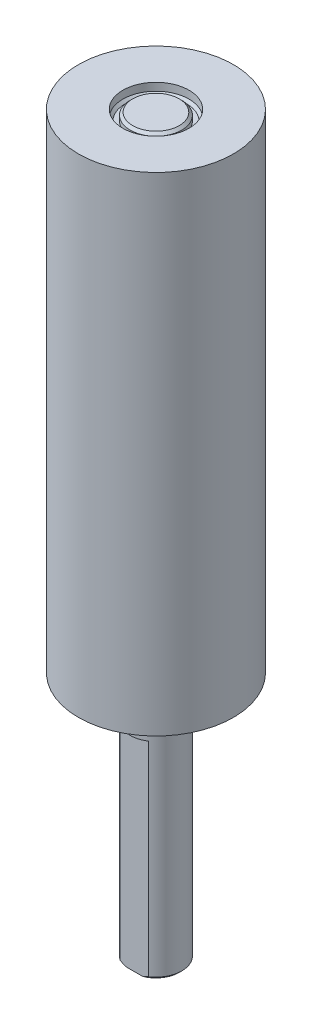
ISO-10303-21;
HEADER;
FILE_DESCRIPTION(('STEP AP214'),'2;1');
FILE_NAME('part.step','',(''),(''),'','','');
FILE_SCHEMA(('AUTOMOTIVE_DESIGN { 1 0 10303 214 1 1 1 1 }'));
ENDSEC;
DATA;
#1=APPLICATION_CONTEXT('core data for automotive mechanical design processes');
#2=APPLICATION_PROTOCOL_DEFINITION('international standard','automotive_design',2000,#1);
#3=PRODUCT_CONTEXT('',#1,'mechanical');
#4=PRODUCT('Part','Part','',(#3));
#5=PRODUCT_RELATED_PRODUCT_CATEGORY('part','',(#4));
#6=PRODUCT_DEFINITION_FORMATION('','',#4);
#7=PRODUCT_DEFINITION_CONTEXT('part definition',#1,'design');
#8=PRODUCT_DEFINITION('design','',#6,#7);
#9=PRODUCT_DEFINITION_SHAPE('','',#8);
#10=(LENGTH_UNIT() NAMED_UNIT(*) SI_UNIT(.MILLI.,.METRE.));
#11=(NAMED_UNIT(*) PLANE_ANGLE_UNIT() SI_UNIT($,.RADIAN.));
#12=(NAMED_UNIT(*) SI_UNIT($,.STERADIAN.) SOLID_ANGLE_UNIT());
#13=UNCERTAINTY_MEASURE_WITH_UNIT(LENGTH_MEASURE(1.E-05),#10,'distance_accuracy_value','');
#14=(GEOMETRIC_REPRESENTATION_CONTEXT(3) GLOBAL_UNCERTAINTY_ASSIGNED_CONTEXT((#13)) GLOBAL_UNIT_ASSIGNED_CONTEXT((#10,
#11,#12)) REPRESENTATION_CONTEXT('',''));
#15=CARTESIAN_POINT('',(0.,0.,0.));
#16=DIRECTION('',(0.,0.,1.));
#17=DIRECTION('',(1.,0.,0.));
#18=AXIS2_PLACEMENT_3D('',#15,#16,#17);
#19=CARTESIAN_POINT('',(0.,-8.,0.));
#20=DIRECTION('',(0.,1.,0.));
#21=DIRECTION('',(0.,0.,1.));
#22=AXIS2_PLACEMENT_3D('',#19,#20,#21);
#23=CYLINDRICAL_SURFACE('',#22,7.5);
#24=CARTESIAN_POINT('',(0.,-8.,0.));
#25=DIRECTION('',(0.,1.,0.));
#26=DIRECTION('',(0.,0.,1.));
#27=AXIS2_PLACEMENT_3D('',#24,#25,#26);
#28=CIRCLE('',#27,7.5);
#29=CARTESIAN_POINT('',(0.,-8.,7.5));
#30=VERTEX_POINT('',#29);
#31=EDGE_CURVE('E97',#30,#30,#28,.T.);
#32=ORIENTED_EDGE('',*,*,#31,.T.);
#33=EDGE_LOOP('',(#32));
#34=FACE_BOUND('',#33,.T.);
#35=CARTESIAN_POINT('',(0.,39.25,0.));
#36=DIRECTION('',(0.,1.,0.));
#37=DIRECTION('',(0.,0.,1.));
#38=AXIS2_PLACEMENT_3D('',#35,#36,#37);
#39=CIRCLE('',#38,7.5);
#40=CARTESIAN_POINT('',(0.,39.25,7.5));
#41=VERTEX_POINT('',#40);
#42=EDGE_CURVE('E86',#41,#41,#39,.T.);
#43=ORIENTED_EDGE('',*,*,#42,.F.);
#44=EDGE_LOOP('',(#43));
#45=FACE_BOUND('',#44,.T.);
#46=ADVANCED_FACE('F35',(#34,#45),#23,.T.);
#47=CARTESIAN_POINT('',(7.5,-8.,0.));
#48=DIRECTION('',(0.,-1.,0.));
#49=DIRECTION('',(0.,0.,-1.));
#50=AXIS2_PLACEMENT_3D('',#47,#48,#49);
#51=PLANE('',#50);
#52=CARTESIAN_POINT('',(0.,-8.,0.));
#53=DIRECTION('',(0.,-1.,0.));
#54=DIRECTION('',(0.,0.,-1.));
#55=AXIS2_PLACEMENT_3D('',#52,#53,#54);
#56=CIRCLE('',#55,3.2);
#57=CARTESIAN_POINT('',(0.,-8.,-3.2));
#58=VERTEX_POINT('',#57);
#59=EDGE_CURVE('E94',#58,#58,#56,.T.);
#60=ORIENTED_EDGE('',*,*,#59,.F.);
#61=EDGE_LOOP('',(#60));
#62=FACE_BOUND('',#61,.T.);
#63=ORIENTED_EDGE('',*,*,#31,.F.);
#64=EDGE_LOOP('',(#63));
#65=FACE_BOUND('',#64,.T.);
#66=ADVANCED_FACE('F145',(#62,#65),#51,.T.);
#67=CARTESIAN_POINT('',(0.,39.25,0.));
#68=DIRECTION('',(0.,1.,0.));
#69=DIRECTION('',(0.,0.,1.));
#70=AXIS2_PLACEMENT_3D('',#67,#68,#69);
#71=PLANE('',#70);
#72=CARTESIAN_POINT('',(0.,39.25,0.));
#73=DIRECTION('',(0.,1.,0.));
#74=DIRECTION('',(0.,0.,1.));
#75=AXIS2_PLACEMENT_3D('',#72,#73,#74);
#76=CIRCLE('',#75,3.19999999999999);
#77=CARTESIAN_POINT('',(0.,39.25,3.19999999999999));
#78=VERTEX_POINT('',#77);
#79=EDGE_CURVE('E315',#78,#78,#76,.T.);
#80=ORIENTED_EDGE('',*,*,#79,.F.);
#81=EDGE_LOOP('',(#80));
#82=FACE_BOUND('',#81,.T.);
#83=ORIENTED_EDGE('',*,*,#42,.T.);
#84=EDGE_LOOP('',(#83));
#85=FACE_BOUND('',#84,.T.);
#86=ADVANCED_FACE('F141',(#82,#85),#71,.T.);
#87=CARTESIAN_POINT('',(0.,-9.,0.));
#88=DIRECTION('',(0.,1.,0.));
#89=DIRECTION('',(0.,0.,1.));
#90=AXIS2_PLACEMENT_3D('',#87,#88,#89);
#91=CYLINDRICAL_SURFACE('',#90,3.2);
#92=CARTESIAN_POINT('',(0.,-8.7499999999999,0.));
#93=DIRECTION('',(0.,-1.,0.));
#94=DIRECTION('',(0.,0.,-1.));
#95=AXIS2_PLACEMENT_3D('',#92,#93,#94);
#96=CIRCLE('',#95,3.2);
#97=CARTESIAN_POINT('',(0.,-8.7499999999999,-3.2));
#98=VERTEX_POINT('',#97);
#99=EDGE_CURVE('E295',#98,#98,#96,.F.);
#100=ORIENTED_EDGE('',*,*,#99,.T.);
#101=EDGE_LOOP('',(#100));
#102=FACE_BOUND('',#101,.T.);
#103=ORIENTED_EDGE('',*,*,#59,.T.);
#104=EDGE_LOOP('',(#103));
#105=FACE_BOUND('',#104,.T.);
#106=ADVANCED_FACE('F137',(#102,#105),#91,.T.);
#107=CARTESIAN_POINT('',(0.,-9.,0.));
#108=DIRECTION('',(0.,-1.,0.));
#109=DIRECTION('',(0.,0.,-1.));
#110=AXIS2_PLACEMENT_3D('',#107,#108,#109);
#111=PLANE('',#110);
#112=CARTESIAN_POINT('',(0.,-9.,0.));
#113=DIRECTION('',(0.,-1.,0.));
#114=DIRECTION('',(0.,0.,-1.));
#115=AXIS2_PLACEMENT_3D('',#112,#113,#114);
#116=CIRCLE('',#115,2.95000000000012);
#117=CARTESIAN_POINT('',(0.,-9.,-2.95000000000012));
#118=VERTEX_POINT('',#117);
#119=EDGE_CURVE('E298',#118,#118,#116,.T.);
#120=ORIENTED_EDGE('',*,*,#119,.T.);
#121=EDGE_LOOP('',(#120));
#122=FACE_BOUND('',#121,.T.);
#123=CARTESIAN_POINT('',(0.,-9.,0.));
#124=DIRECTION('',(0.,-1.,0.));
#125=DIRECTION('',(0.,0.,-1.));
#126=AXIS2_PLACEMENT_3D('',#123,#124,#125);
#127=CIRCLE('',#126,2.5);
#128=CARTESIAN_POINT('',(0.,-9.,-2.5));
#129=VERTEX_POINT('',#128);
#130=EDGE_CURVE('E90',#129,#129,#127,.T.);
#131=ORIENTED_EDGE('',*,*,#130,.F.);
#132=EDGE_LOOP('',(#131));
#133=FACE_BOUND('',#132,.T.);
#134=ADVANCED_FACE('F134',(#122,#133),#111,.T.);
#135=CARTESIAN_POINT('',(0.,-32.,0.));
#136=DIRECTION('',(0.,1.,0.));
#137=DIRECTION('',(0.,0.,1.));
#138=AXIS2_PLACEMENT_3D('',#135,#136,#137);
#139=CYLINDRICAL_SURFACE('',#138,2.5);
#140=DIRECTION('',(0.,-1.,0.));
#141=VECTOR('',#140,1.);
#142=CARTESIAN_POINT('',(1.35646599662505,-12.,2.1));
#143=LINE('',#142,#141);
#144=CARTESIAN_POINT('',(1.35646599662505,-12.,2.1));
#145=VERTEX_POINT('',#144);
#146=CARTESIAN_POINT('',(1.35646599662505,-31.7499999999999,2.1));
#147=VERTEX_POINT('',#146);
#148=EDGE_CURVE('E81',#145,#147,#143,.T.);
#149=ORIENTED_EDGE('',*,*,#148,.T.);
#150=CARTESIAN_POINT('',(0.,-31.7499999999999,0.));
#151=DIRECTION('',(0.,-1.,0.));
#152=DIRECTION('',(0.,0.,-1.));
#153=AXIS2_PLACEMENT_3D('',#150,#151,#152);
#154=CIRCLE('',#153,2.5);
#155=CARTESIAN_POINT('',(-1.35646599662505,-31.7499999999999,2.1));
#156=VERTEX_POINT('',#155);
#157=EDGE_CURVE('E51',#147,#156,#154,.F.);
#158=ORIENTED_EDGE('',*,*,#157,.T.);
#159=DIRECTION('',(0.,-1.,0.));
#160=VECTOR('',#159,1.);
#161=CARTESIAN_POINT('',(-1.35646599662505,-12.,2.1));
#162=LINE('',#161,#160);
#163=CARTESIAN_POINT('',(-1.35646599662505,-12.,2.1));
#164=VERTEX_POINT('',#163);
#165=EDGE_CURVE('E79',#164,#156,#162,.T.);
#166=ORIENTED_EDGE('',*,*,#165,.F.);
#167=CARTESIAN_POINT('',(0.,-12.,0.));
#168=DIRECTION('',(0.,-1.,0.));
#169=DIRECTION('',(0.,0.,-1.));
#170=AXIS2_PLACEMENT_3D('',#167,#168,#169);
#171=CIRCLE('',#170,2.5);
#172=EDGE_CURVE('E72',#145,#164,#171,.T.);
#173=ORIENTED_EDGE('',*,*,#172,.F.);
#174=EDGE_LOOP('',(#149,#158,#166,#173));
#175=FACE_BOUND('',#174,.T.);
#176=ORIENTED_EDGE('',*,*,#130,.T.);
#177=EDGE_LOOP('',(#176));
#178=FACE_BOUND('',#177,.T.);
#179=ADVANCED_FACE('F83',(#175,#178),#139,.T.);
#180=CARTESIAN_POINT('',(0.,-32.,0.));
#181=DIRECTION('',(0.,-1.,0.));
#182=DIRECTION('',(0.,0.,-1.));
#183=AXIS2_PLACEMENT_3D('',#180,#181,#182);
#184=PLANE('',#183);
#185=DIRECTION('',(1.,0.,0.));
#186=VECTOR('',#185,1.);
#187=CARTESIAN_POINT('',(-1.35646599662505,-32.,2.1));
#188=LINE('',#187,#186);
#189=CARTESIAN_POINT('',(-0.80777472107053,-32.,2.1));
#190=VERTEX_POINT('',#189);
#191=CARTESIAN_POINT('',(0.80777472107053,-32.,2.1));
#192=VERTEX_POINT('',#191);
#193=EDGE_CURVE('E76',#190,#192,#188,.T.);
#194=ORIENTED_EDGE('',*,*,#193,.F.);
#195=CARTESIAN_POINT('',(0.,-32.,0.));
#196=DIRECTION('',(0.,-1.,0.));
#197=DIRECTION('',(0.,0.,-1.));
#198=AXIS2_PLACEMENT_3D('',#195,#196,#197);
#199=CIRCLE('',#198,2.25000000000013);
#200=EDGE_CURVE('E93',#190,#192,#199,.T.);
#201=ORIENTED_EDGE('',*,*,#200,.T.);
#202=EDGE_LOOP('',(#194,#201));
#203=FACE_BOUND('',#202,.T.);
#204=ADVANCED_FACE('F126',(#203),#184,.T.);
#205=CARTESIAN_POINT('',(-1.35646599662505,-12.,2.1));
#206=DIRECTION('',(0.,0.,-1.));
#207=DIRECTION('',(-1.,0.,0.));
#208=AXIS2_PLACEMENT_3D('',#205,#206,#207);
#209=PLANE('',#208);
#210=ORIENTED_EDGE('',*,*,#193,.T.);
#211=CARTESIAN_POINT('',(0.80777472107053,-32.,2.1));
#212=CARTESIAN_POINT('',(0.855158221162531,-31.9829853366427,2.1));
#213=CARTESIAN_POINT('',(0.90211707844897,-31.9648261055617,2.1));
#214=CARTESIAN_POINT('',(0.99514421459479,-31.9265297964686,2.1));
#215=CARTESIAN_POINT('',(1.04121367958915,-31.9063956071032,2.1));
#216=CARTESIAN_POINT('',(1.13254593301413,-31.8644151543814,2.1));
#217=CARTESIAN_POINT('',(1.17780891742949,-31.8425693141391,2.1));
#218=CARTESIAN_POINT('',(1.26765376254289,-31.7973599317834,2.1));
#219=CARTESIAN_POINT('',(1.31223454651671,-31.7739942458067,2.1));
#220=CARTESIAN_POINT('',(1.35646599662505,-31.7499999999999,2.1));
#221=B_SPLINE_CURVE_WITH_KNOTS('',3,(#211,#212,#213,#214,#215,#216,#217,#218,#219,#220),
.UNSPECIFIED.,.F.,.F.,(4,2,2,2,4),(0.,0.151004069712301,0.301790478450222,0.452539730218074,
0.603506441452608),.UNSPECIFIED.);
#222=EDGE_CURVE('E59',#192,#147,#221,.T.);
#223=ORIENTED_EDGE('',*,*,#222,.T.);
#224=ORIENTED_EDGE('',*,*,#148,.F.);
#225=DIRECTION('',(1.,0.,0.));
#226=VECTOR('',#225,1.);
#227=CARTESIAN_POINT('',(-1.35646599662505,-12.,2.1));
#228=LINE('',#227,#226);
#229=EDGE_CURVE('E75',#164,#145,#228,.T.);
#230=ORIENTED_EDGE('',*,*,#229,.F.);
#231=ORIENTED_EDGE('',*,*,#165,.T.);
#232=CARTESIAN_POINT('',(-1.35646599662505,-31.7499999999999,2.1));
#233=CARTESIAN_POINT('',(-1.31223454651671,-31.7739942458067,2.1));
#234=CARTESIAN_POINT('',(-1.26765376254289,-31.7973599317834,2.1));
#235=CARTESIAN_POINT('',(-1.17780891742949,-31.8425693141391,2.1));
#236=CARTESIAN_POINT('',(-1.13254593301413,-31.8644151543814,2.1));
#237=CARTESIAN_POINT('',(-1.04121367958915,-31.9063956071032,2.1));
#238=CARTESIAN_POINT('',(-0.99514421459479,-31.9265297964686,2.1));
#239=CARTESIAN_POINT('',(-0.902117078448969,-31.9648261055617,2.1));
#240=CARTESIAN_POINT('',(-0.85515822116253,-31.9829853366427,2.1));
#241=CARTESIAN_POINT('',(-0.807774721070529,-32.,2.1));
#242=B_SPLINE_CURVE_WITH_KNOTS('',3,(#232,#233,#234,#235,#236,#237,#238,#239,#240,#241),
.UNSPECIFIED.,.F.,.F.,(4,2,2,2,4),(0.,0.150966711234534,0.301715963002387,0.452502371740308,
0.603506441452609),.UNSPECIFIED.);
#243=EDGE_CURVE('E104',#156,#190,#242,.T.);
#244=ORIENTED_EDGE('',*,*,#243,.T.);
#245=EDGE_LOOP('',(#210,#223,#224,#230,#231,#244));
#246=FACE_BOUND('',#245,.T.);
#247=ADVANCED_FACE('F78',(#246),#209,.F.);
#248=CARTESIAN_POINT('',(0.,-12.,0.));
#249=DIRECTION('',(0.,-1.,0.));
#250=DIRECTION('',(0.,0.,-1.));
#251=AXIS2_PLACEMENT_3D('',#248,#249,#250);
#252=PLANE('',#251);
#253=ORIENTED_EDGE('',*,*,#172,.T.);
#254=ORIENTED_EDGE('',*,*,#229,.T.);
#255=EDGE_LOOP('',(#253,#254));
#256=FACE_BOUND('',#255,.T.);
#257=ADVANCED_FACE('F74',(#256),#252,.T.);
#258=CARTESIAN_POINT('',(0.,38.25,0.));
#259=DIRECTION('',(0.,-1.,0.));
#260=DIRECTION('',(0.,0.,-1.));
#261=AXIS2_PLACEMENT_3D('',#258,#259,#260);
#262=PLANE('',#261);
#263=CARTESIAN_POINT('',(0.,38.25,0.));
#264=DIRECTION('',(0.,-1.,0.));
#265=DIRECTION('',(0.,0.,-1.));
#266=AXIS2_PLACEMENT_3D('',#263,#264,#265);
#267=CIRCLE('',#266,2.95000000000013);
#268=CARTESIAN_POINT('',(0.,38.25,-2.95000000000013));
#269=VERTEX_POINT('',#268);
#270=EDGE_CURVE('E44',#269,#269,#267,.F.);
#271=ORIENTED_EDGE('',*,*,#270,.T.);
#272=EDGE_LOOP('',(#271));
#273=FACE_BOUND('',#272,.T.);
#274=CARTESIAN_POINT('',(0.,38.25,0.));
#275=DIRECTION('',(0.,1.,0.));
#276=DIRECTION('',(0.,0.,1.));
#277=AXIS2_PLACEMENT_3D('',#274,#275,#276);
#278=CIRCLE('',#277,2.5);
#279=CARTESIAN_POINT('',(0.,38.25,2.5));
#280=VERTEX_POINT('',#279);
#281=EDGE_CURVE('E313',#280,#280,#278,.T.);
#282=ORIENTED_EDGE('',*,*,#281,.F.);
#283=EDGE_LOOP('',(#282));
#284=FACE_BOUND('',#283,.T.);
#285=ADVANCED_FACE('F193',(#273,#284),#262,.F.);
#286=CARTESIAN_POINT('',(0.,39.25,0.));
#287=DIRECTION('',(0.,1.,0.));
#288=DIRECTION('',(0.,0.,1.));
#289=AXIS2_PLACEMENT_3D('',#286,#287,#288);
#290=CYLINDRICAL_SURFACE('',#289,3.19999999999999);
#291=CARTESIAN_POINT('',(0.,38.5000000000001,0.));
#292=DIRECTION('',(0.,-1.,0.));
#293=DIRECTION('',(0.,0.,-1.));
#294=AXIS2_PLACEMENT_3D('',#291,#292,#293);
#295=CIRCLE('',#294,3.19999999999999);
#296=CARTESIAN_POINT('',(0.,38.5000000000001,-3.19999999999999));
#297=VERTEX_POINT('',#296);
#298=EDGE_CURVE('E11',#297,#297,#295,.T.);
#299=ORIENTED_EDGE('',*,*,#298,.T.);
#300=EDGE_LOOP('',(#299));
#301=FACE_BOUND('',#300,.T.);
#302=ORIENTED_EDGE('',*,*,#79,.T.);
#303=EDGE_LOOP('',(#302));
#304=FACE_BOUND('',#303,.T.);
#305=ADVANCED_FACE('F198',(#301,#304),#290,.F.);
#306=CARTESIAN_POINT('',(0.,38.25,0.));
#307=DIRECTION('',(0.,1.,0.));
#308=DIRECTION('',(0.,0.,1.));
#309=AXIS2_PLACEMENT_3D('',#306,#307,#308);
#310=CYLINDRICAL_SURFACE('',#309,2.5);
#311=CARTESIAN_POINT('',(0.,38.7499999999999,0.));
#312=DIRECTION('',(0.,1.,0.));
#313=DIRECTION('',(0.,0.,1.));
#314=AXIS2_PLACEMENT_3D('',#311,#312,#313);
#315=CIRCLE('',#314,2.5);
#316=CARTESIAN_POINT('',(0.,38.7499999999999,2.5));
#317=VERTEX_POINT('',#316);
#318=EDGE_CURVE('E288',#317,#317,#315,.F.);
#319=ORIENTED_EDGE('',*,*,#318,.T.);
#320=EDGE_LOOP('',(#319));
#321=FACE_BOUND('',#320,.T.);
#322=ORIENTED_EDGE('',*,*,#281,.T.);
#323=EDGE_LOOP('',(#322));
#324=FACE_BOUND('',#323,.T.);
#325=ADVANCED_FACE('F205',(#321,#324),#310,.T.);
#326=CARTESIAN_POINT('',(0.,39.,0.));
#327=DIRECTION('',(0.,1.,0.));
#328=DIRECTION('',(0.,0.,1.));
#329=AXIS2_PLACEMENT_3D('',#326,#327,#328);
#330=PLANE('',#329);
#331=CARTESIAN_POINT('',(0.,39.,0.));
#332=DIRECTION('',(0.,1.,0.));
#333=DIRECTION('',(0.,0.,1.));
#334=AXIS2_PLACEMENT_3D('',#331,#332,#333);
#335=CIRCLE('',#334,2.25000000000012);
#336=CARTESIAN_POINT('',(0.,39.,2.25000000000012));
#337=VERTEX_POINT('',#336);
#338=EDGE_CURVE('E290',#337,#337,#335,.T.);
#339=ORIENTED_EDGE('',*,*,#338,.T.);
#340=EDGE_LOOP('',(#339));
#341=FACE_BOUND('',#340,.T.);
#342=ADVANCED_FACE('F213',(#341),#330,.T.);
#343=CARTESIAN_POINT('',(0.,-32.,0.));
#344=DIRECTION('',(0.,1.,0.));
#345=DIRECTION('',(0.,0.,1.));
#346=AXIS2_PLACEMENT_3D('',#343,#344,#345);
#347=CONICAL_SURFACE('',#346,2.25000000000013,0.785398163396986);
#348=ORIENTED_EDGE('',*,*,#243,.F.);
#349=ORIENTED_EDGE('',*,*,#157,.F.);
#350=ORIENTED_EDGE('',*,*,#222,.F.);
#351=ORIENTED_EDGE('',*,*,#200,.F.);
#352=EDGE_LOOP('',(#348,#349,#350,#351));
#353=FACE_BOUND('',#352,.T.);
#354=ADVANCED_FACE('F118',(#353),#347,.T.);
#355=CARTESIAN_POINT('',(0.,-9.,0.));
#356=DIRECTION('',(0.,1.,0.));
#357=DIRECTION('',(0.,0.,1.));
#358=AXIS2_PLACEMENT_3D('',#355,#356,#357);
#359=CONICAL_SURFACE('',#358,2.95000000000012,0.785398163397003);
#360=ORIENTED_EDGE('',*,*,#99,.F.);
#361=EDGE_LOOP('',(#360));
#362=FACE_BOUND('',#361,.T.);
#363=ORIENTED_EDGE('',*,*,#119,.F.);
#364=EDGE_LOOP('',(#363));
#365=FACE_BOUND('',#364,.T.);
#366=ADVANCED_FACE('F228',(#362,#365),#359,.T.);
#367=CARTESIAN_POINT('',(0.,39.,0.));
#368=DIRECTION('',(0.,-1.,0.));
#369=DIRECTION('',(0.,0.,-1.));
#370=AXIS2_PLACEMENT_3D('',#367,#368,#369);
#371=CONICAL_SURFACE('',#370,2.25000000000012,0.785398163397);
#372=ORIENTED_EDGE('',*,*,#318,.F.);
#373=EDGE_LOOP('',(#372));
#374=FACE_BOUND('',#373,.T.);
#375=ORIENTED_EDGE('',*,*,#338,.F.);
#376=EDGE_LOOP('',(#375));
#377=FACE_BOUND('',#376,.T.);
#378=ADVANCED_FACE('F235',(#374,#377),#371,.T.);
#379=CARTESIAN_POINT('',(0.,38.25,0.));
#380=DIRECTION('',(0.,1.,0.));
#381=DIRECTION('',(0.,0.,1.));
#382=AXIS2_PLACEMENT_3D('',#379,#380,#381);
#383=CONICAL_SURFACE('',#382,2.95000000000013,0.785398163397008);
#384=ORIENTED_EDGE('',*,*,#298,.F.);
#385=EDGE_LOOP('',(#384));
#386=FACE_BOUND('',#385,.T.);
#387=ORIENTED_EDGE('',*,*,#270,.F.);
#388=EDGE_LOOP('',(#387));
#389=FACE_BOUND('',#388,.T.);
#390=ADVANCED_FACE('F38',(#386,#389),#383,.F.);
#391=CLOSED_SHELL('',(#46,#66,#86,#106,#134,#179,#204,#247,#257,#285,#305,#325,#342,#354,#366,
#378,#390));
#392=MANIFOLD_SOLID_BREP('B2',#391);
#393=ADVANCED_BREP_SHAPE_REPRESENTATION('',(#18,#392),#14);
#394=SHAPE_DEFINITION_REPRESENTATION(#9,#393);
ENDSEC;
END-ISO-10303-21;
